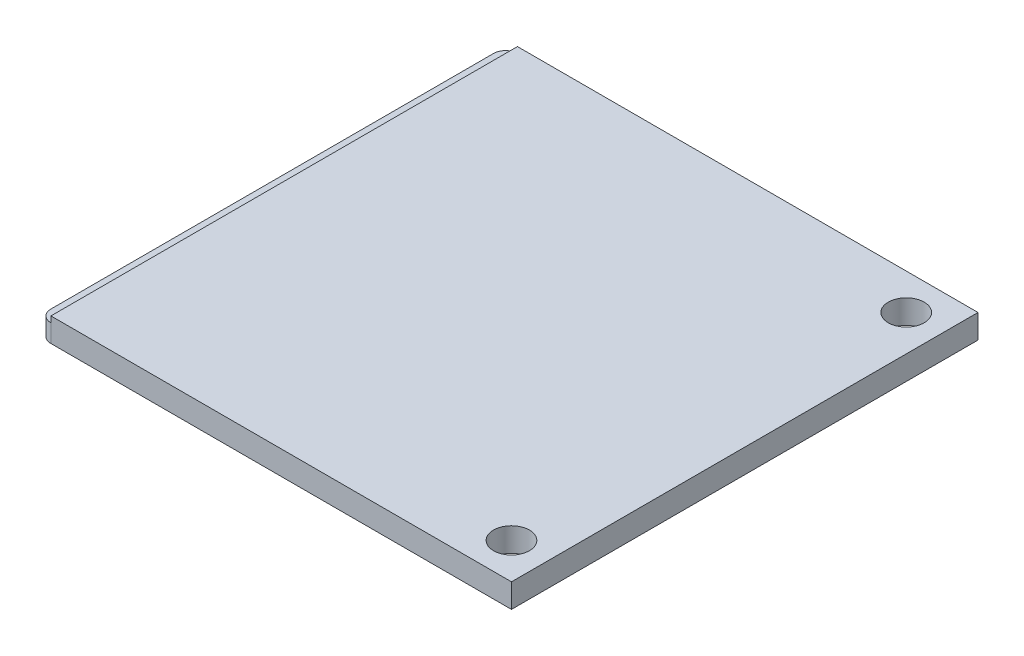
ISO-10303-21;
HEADER;
FILE_DESCRIPTION(('STEP AP214'),'2;1');
FILE_NAME('part.step','',(''),(''),'','','');
FILE_SCHEMA(('AUTOMOTIVE_DESIGN { 1 0 10303 214 1 1 1 1 }'));
ENDSEC;
DATA;
#1=APPLICATION_CONTEXT('core data for automotive mechanical design processes');
#2=APPLICATION_PROTOCOL_DEFINITION('international standard','automotive_design',2000,#1);
#3=PRODUCT_CONTEXT('',#1,'mechanical');
#4=PRODUCT('Part','Part','',(#3));
#5=PRODUCT_RELATED_PRODUCT_CATEGORY('part','',(#4));
#6=PRODUCT_DEFINITION_FORMATION('','',#4);
#7=PRODUCT_DEFINITION_CONTEXT('part definition',#1,'design');
#8=PRODUCT_DEFINITION('design','',#6,#7);
#9=PRODUCT_DEFINITION_SHAPE('','',#8);
#10=(LENGTH_UNIT() NAMED_UNIT(*) SI_UNIT(.MILLI.,.METRE.));
#11=(NAMED_UNIT(*) PLANE_ANGLE_UNIT() SI_UNIT($,.RADIAN.));
#12=(NAMED_UNIT(*) SI_UNIT($,.STERADIAN.) SOLID_ANGLE_UNIT());
#13=UNCERTAINTY_MEASURE_WITH_UNIT(LENGTH_MEASURE(1.E-05),#10,'distance_accuracy_value','');
#14=(GEOMETRIC_REPRESENTATION_CONTEXT(3) GLOBAL_UNCERTAINTY_ASSIGNED_CONTEXT((#13)) GLOBAL_UNIT_ASSIGNED_CONTEXT((#10,
#11,#12)) REPRESENTATION_CONTEXT('',''));
#15=CARTESIAN_POINT('',(0.,0.,0.));
#16=DIRECTION('',(0.,0.,1.));
#17=DIRECTION('',(1.,0.,0.));
#18=AXIS2_PLACEMENT_3D('',#15,#16,#17);
#19=CARTESIAN_POINT('',(0.,2.,0.));
#20=DIRECTION('',(1.,0.,0.));
#21=DIRECTION('',(0.,0.,-1.));
#22=AXIS2_PLACEMENT_3D('',#19,#20,#21);
#23=PLANE('',#22);
#24=DIRECTION('',(0.,0.,1.));
#25=VECTOR('',#24,1.);
#26=CARTESIAN_POINT('',(0.,1.5,0.));
#27=LINE('',#26,#25);
#28=CARTESIAN_POINT('',(0.,1.5,1.));
#29=VERTEX_POINT('',#28);
#30=CARTESIAN_POINT('',(0.,1.5,38.));
#31=VERTEX_POINT('',#30);
#32=EDGE_CURVE('E106',#29,#31,#27,.T.);
#33=ORIENTED_EDGE('',*,*,#32,.F.);
#34=DIRECTION('',(0.,-1.,0.));
#35=VECTOR('',#34,1.);
#36=CARTESIAN_POINT('',(0.,2.,1.));
#37=LINE('',#36,#35);
#38=CARTESIAN_POINT('',(0.,0.,1.));
#39=VERTEX_POINT('',#38);
#40=EDGE_CURVE('E274',#29,#39,#37,.T.);
#41=ORIENTED_EDGE('',*,*,#40,.T.);
#42=DIRECTION('',(0.,0.,1.));
#43=VECTOR('',#42,1.);
#44=CARTESIAN_POINT('',(0.,0.,0.));
#45=LINE('',#44,#43);
#46=CARTESIAN_POINT('',(0.,0.,38.));
#47=VERTEX_POINT('',#46);
#48=EDGE_CURVE('E252',#39,#47,#45,.T.);
#49=ORIENTED_EDGE('',*,*,#48,.T.);
#50=DIRECTION('',(0.,-1.,0.));
#51=VECTOR('',#50,1.);
#52=CARTESIAN_POINT('',(0.,2.,38.));
#53=LINE('',#52,#51);
#54=EDGE_CURVE('E272',#47,#31,#53,.F.);
#55=ORIENTED_EDGE('',*,*,#54,.T.);
#56=EDGE_LOOP('',(#33,#41,#49,#55));
#57=FACE_BOUND('',#56,.T.);
#58=ADVANCED_FACE('F39',(#57),#23,.F.);
#59=CARTESIAN_POINT('',(0.,2.,39.));
#60=DIRECTION('',(0.,0.,-1.));
#61=DIRECTION('',(-1.,0.,0.));
#62=AXIS2_PLACEMENT_3D('',#59,#60,#61);
#63=PLANE('',#62);
#64=DIRECTION('',(0.,1.,0.));
#65=VECTOR('',#64,1.);
#66=CARTESIAN_POINT('',(1.,1.5,39.));
#67=LINE('',#66,#65);
#68=CARTESIAN_POINT('',(1.,1.5,39.));
#69=VERTEX_POINT('',#68);
#70=CARTESIAN_POINT('',(1.,2.,39.));
#71=VERTEX_POINT('',#70);
#72=EDGE_CURVE('E114',#69,#71,#67,.T.);
#73=ORIENTED_EDGE('',*,*,#72,.F.);
#74=DIRECTION('',(0.,-1.,0.));
#75=VECTOR('',#74,1.);
#76=CARTESIAN_POINT('',(1.,2.,39.));
#77=LINE('',#76,#75);
#78=CARTESIAN_POINT('',(1.,0.,39.));
#79=VERTEX_POINT('',#78);
#80=EDGE_CURVE('E11',#69,#79,#77,.T.);
#81=ORIENTED_EDGE('',*,*,#80,.T.);
#82=DIRECTION('',(1.,0.,0.));
#83=VECTOR('',#82,1.);
#84=CARTESIAN_POINT('',(0.,0.,39.));
#85=LINE('',#84,#83);
#86=CARTESIAN_POINT('',(39.5,0.,39.));
#87=VERTEX_POINT('',#86);
#88=EDGE_CURVE('E263',#79,#87,#85,.T.);
#89=ORIENTED_EDGE('',*,*,#88,.T.);
#90=DIRECTION('',(0.,-1.,0.));
#91=VECTOR('',#90,1.);
#92=CARTESIAN_POINT('',(39.5,2.,39.));
#93=LINE('',#92,#91);
#94=CARTESIAN_POINT('',(39.5,2.,39.));
#95=VERTEX_POINT('',#94);
#96=EDGE_CURVE('E269',#95,#87,#93,.T.);
#97=ORIENTED_EDGE('',*,*,#96,.F.);
#98=DIRECTION('',(1.,0.,0.));
#99=VECTOR('',#98,1.);
#100=CARTESIAN_POINT('',(0.,2.,39.));
#101=LINE('',#100,#99);
#102=EDGE_CURVE('E125',#71,#95,#101,.T.);
#103=ORIENTED_EDGE('',*,*,#102,.F.);
#104=EDGE_LOOP('',(#73,#81,#89,#97,#103));
#105=FACE_BOUND('',#104,.T.);
#106=ADVANCED_FACE('F117',(#105),#63,.F.);
#107=CARTESIAN_POINT('',(39.5,2.,0.));
#108=DIRECTION('',(-1.,0.,0.));
#109=DIRECTION('',(0.,0.,1.));
#110=AXIS2_PLACEMENT_3D('',#107,#108,#109);
#111=PLANE('',#110);
#112=DIRECTION('',(0.,0.,-1.));
#113=VECTOR('',#112,1.);
#114=CARTESIAN_POINT('',(39.5,0.,0.));
#115=LINE('',#114,#113);
#116=CARTESIAN_POINT('',(39.5,0.,0.));
#117=VERTEX_POINT('',#116);
#118=EDGE_CURVE('E264',#87,#117,#115,.T.);
#119=ORIENTED_EDGE('',*,*,#118,.T.);
#120=DIRECTION('',(0.,-1.,0.));
#121=VECTOR('',#120,1.);
#122=CARTESIAN_POINT('',(39.5,2.,0.));
#123=LINE('',#122,#121);
#124=CARTESIAN_POINT('',(39.5,2.,0.));
#125=VERTEX_POINT('',#124);
#126=EDGE_CURVE('E257',#125,#117,#123,.T.);
#127=ORIENTED_EDGE('',*,*,#126,.F.);
#128=DIRECTION('',(0.,0.,-1.));
#129=VECTOR('',#128,1.);
#130=CARTESIAN_POINT('',(39.5,2.,0.));
#131=LINE('',#130,#129);
#132=EDGE_CURVE('E255',#95,#125,#131,.T.);
#133=ORIENTED_EDGE('',*,*,#132,.F.);
#134=ORIENTED_EDGE('',*,*,#96,.T.);
#135=EDGE_LOOP('',(#119,#127,#133,#134));
#136=FACE_BOUND('',#135,.T.);
#137=ADVANCED_FACE('F140',(#136),#111,.F.);
#138=CARTESIAN_POINT('',(0.,2.,0.));
#139=DIRECTION('',(0.,0.,1.));
#140=DIRECTION('',(1.,0.,0.));
#141=AXIS2_PLACEMENT_3D('',#138,#139,#140);
#142=PLANE('',#141);
#143=DIRECTION('',(-1.,0.,0.));
#144=VECTOR('',#143,1.);
#145=CARTESIAN_POINT('',(0.,0.,0.));
#146=LINE('',#145,#144);
#147=CARTESIAN_POINT('',(1.,0.,0.));
#148=VERTEX_POINT('',#147);
#149=EDGE_CURVE('E254',#117,#148,#146,.T.);
#150=ORIENTED_EDGE('',*,*,#149,.T.);
#151=DIRECTION('',(0.,-1.,0.));
#152=VECTOR('',#151,1.);
#153=CARTESIAN_POINT('',(1.,2.,0.));
#154=LINE('',#153,#152);
#155=CARTESIAN_POINT('',(1.,1.5,0.));
#156=VERTEX_POINT('',#155);
#157=EDGE_CURVE('E110',#148,#156,#154,.F.);
#158=ORIENTED_EDGE('',*,*,#157,.T.);
#159=DIRECTION('',(0.,1.,0.));
#160=VECTOR('',#159,1.);
#161=CARTESIAN_POINT('',(1.,1.5,0.));
#162=LINE('',#161,#160);
#163=CARTESIAN_POINT('',(1.,2.,0.));
#164=VERTEX_POINT('',#163);
#165=EDGE_CURVE('E119',#156,#164,#162,.T.);
#166=ORIENTED_EDGE('',*,*,#165,.T.);
#167=DIRECTION('',(-1.,0.,0.));
#168=VECTOR('',#167,1.);
#169=CARTESIAN_POINT('',(0.,2.,0.));
#170=LINE('',#169,#168);
#171=EDGE_CURVE('E260',#125,#164,#170,.T.);
#172=ORIENTED_EDGE('',*,*,#171,.F.);
#173=ORIENTED_EDGE('',*,*,#126,.T.);
#174=EDGE_LOOP('',(#150,#158,#166,#172,#173));
#175=FACE_BOUND('',#174,.T.);
#176=ADVANCED_FACE('F141',(#175),#142,.F.);
#177=CARTESIAN_POINT('',(0.,2.,0.));
#178=DIRECTION('',(0.,1.,0.));
#179=DIRECTION('',(0.,0.,1.));
#180=AXIS2_PLACEMENT_3D('',#177,#178,#179);
#181=PLANE('',#180);
#182=DIRECTION('',(0.,0.,-1.));
#183=VECTOR('',#182,1.);
#184=CARTESIAN_POINT('',(1.,2.,0.));
#185=LINE('',#184,#183);
#186=EDGE_CURVE('E281',#71,#164,#185,.T.);
#187=ORIENTED_EDGE('',*,*,#186,.F.);
#188=ORIENTED_EDGE('',*,*,#102,.T.);
#189=ORIENTED_EDGE('',*,*,#132,.T.);
#190=ORIENTED_EDGE('',*,*,#171,.T.);
#191=EDGE_LOOP('',(#187,#188,#189,#190));
#192=FACE_BOUND('',#191,.T.);
#193=CARTESIAN_POINT('',(36.5,2.,3.));
#194=DIRECTION('',(0.,1.,0.));
#195=DIRECTION('',(0.,0.,1.));
#196=AXIS2_PLACEMENT_3D('',#193,#194,#195);
#197=CIRCLE('',#196,1.49999999999999);
#198=CARTESIAN_POINT('',(36.5,2.,4.49999999999999));
#199=VERTEX_POINT('',#198);
#200=EDGE_CURVE('E238',#199,#199,#197,.T.);
#201=ORIENTED_EDGE('',*,*,#200,.F.);
#202=EDGE_LOOP('',(#201));
#203=FACE_BOUND('',#202,.T.);
#204=CARTESIAN_POINT('',(36.5,2.,36.));
#205=DIRECTION('',(0.,1.,0.));
#206=DIRECTION('',(0.,0.,1.));
#207=AXIS2_PLACEMENT_3D('',#204,#205,#206);
#208=CIRCLE('',#207,1.49999999999999);
#209=CARTESIAN_POINT('',(36.5,2.,37.5));
#210=VERTEX_POINT('',#209);
#211=EDGE_CURVE('E245',#210,#210,#208,.T.);
#212=ORIENTED_EDGE('',*,*,#211,.F.);
#213=EDGE_LOOP('',(#212));
#214=FACE_BOUND('',#213,.T.);
#215=ADVANCED_FACE('F150',(#192,#203,#214),#181,.T.);
#216=CARTESIAN_POINT('',(0.,0.,0.));
#217=DIRECTION('',(0.,1.,0.));
#218=DIRECTION('',(0.,0.,1.));
#219=AXIS2_PLACEMENT_3D('',#216,#217,#218);
#220=PLANE('',#219);
#221=CARTESIAN_POINT('',(36.5,0.,3.));
#222=DIRECTION('',(0.,1.,0.));
#223=DIRECTION('',(0.,0.,1.));
#224=AXIS2_PLACEMENT_3D('',#221,#222,#223);
#225=CIRCLE('',#224,1.5);
#226=CARTESIAN_POINT('',(36.5,0.,4.5));
#227=VERTEX_POINT('',#226);
#228=EDGE_CURVE('E240',#227,#227,#225,.T.);
#229=ORIENTED_EDGE('',*,*,#228,.T.);
#230=EDGE_LOOP('',(#229));
#231=FACE_BOUND('',#230,.T.);
#232=CARTESIAN_POINT('',(36.5,0.,36.));
#233=DIRECTION('',(0.,1.,0.));
#234=DIRECTION('',(0.,0.,1.));
#235=AXIS2_PLACEMENT_3D('',#232,#233,#234);
#236=CIRCLE('',#235,1.5);
#237=CARTESIAN_POINT('',(36.5,0.,37.5));
#238=VERTEX_POINT('',#237);
#239=EDGE_CURVE('E248',#238,#238,#236,.T.);
#240=ORIENTED_EDGE('',*,*,#239,.T.);
#241=EDGE_LOOP('',(#240));
#242=FACE_BOUND('',#241,.T.);
#243=ORIENTED_EDGE('',*,*,#48,.F.);
#244=CARTESIAN_POINT('',(1.,0.,1.));
#245=DIRECTION('',(0.,1.,0.));
#246=DIRECTION('',(0.,0.,1.));
#247=AXIS2_PLACEMENT_3D('',#244,#245,#246);
#248=CIRCLE('',#247,1.);
#249=EDGE_CURVE('E64',#39,#148,#248,.F.);
#250=ORIENTED_EDGE('',*,*,#249,.T.);
#251=ORIENTED_EDGE('',*,*,#149,.F.);
#252=ORIENTED_EDGE('',*,*,#118,.F.);
#253=ORIENTED_EDGE('',*,*,#88,.F.);
#254=CARTESIAN_POINT('',(1.,0.,38.));
#255=DIRECTION('',(0.,1.,0.));
#256=DIRECTION('',(0.,0.,1.));
#257=AXIS2_PLACEMENT_3D('',#254,#255,#256);
#258=CIRCLE('',#257,1.);
#259=EDGE_CURVE('E53',#79,#47,#258,.F.);
#260=ORIENTED_EDGE('',*,*,#259,.T.);
#261=EDGE_LOOP('',(#243,#250,#251,#252,#253,#260));
#262=FACE_BOUND('',#261,.T.);
#263=ADVANCED_FACE('F149',(#231,#242,#262),#220,.F.);
#264=CARTESIAN_POINT('',(36.5,2.,36.));
#265=DIRECTION('',(0.,1.,0.));
#266=DIRECTION('',(0.,0.,1.));
#267=AXIS2_PLACEMENT_3D('',#264,#265,#266);
#268=CYLINDRICAL_SURFACE('',#267,1.49999999999999);
#269=ORIENTED_EDGE('',*,*,#239,.F.);
#270=EDGE_LOOP('',(#269));
#271=FACE_BOUND('',#270,.T.);
#272=ORIENTED_EDGE('',*,*,#211,.T.);
#273=EDGE_LOOP('',(#272));
#274=FACE_BOUND('',#273,.T.);
#275=ADVANCED_FACE('F155',(#271,#274),#268,.F.);
#276=CARTESIAN_POINT('',(36.5,2.,3.));
#277=DIRECTION('',(0.,1.,0.));
#278=DIRECTION('',(0.,0.,1.));
#279=AXIS2_PLACEMENT_3D('',#276,#277,#278);
#280=CYLINDRICAL_SURFACE('',#279,1.49999999999999);
#281=ORIENTED_EDGE('',*,*,#228,.F.);
#282=EDGE_LOOP('',(#281));
#283=FACE_BOUND('',#282,.T.);
#284=ORIENTED_EDGE('',*,*,#200,.T.);
#285=EDGE_LOOP('',(#284));
#286=FACE_BOUND('',#285,.T.);
#287=ADVANCED_FACE('F158',(#283,#286),#280,.F.);
#288=CARTESIAN_POINT('',(1.,1.5,0.));
#289=DIRECTION('',(1.,0.,0.));
#290=DIRECTION('',(0.,0.,-1.));
#291=AXIS2_PLACEMENT_3D('',#288,#289,#290);
#292=PLANE('',#291);
#293=ORIENTED_EDGE('',*,*,#186,.T.);
#294=ORIENTED_EDGE('',*,*,#165,.F.);
#295=DIRECTION('',(0.,0.,-1.));
#296=VECTOR('',#295,1.);
#297=CARTESIAN_POINT('',(1.,1.5,0.));
#298=LINE('',#297,#296);
#299=EDGE_CURVE('E103',#69,#156,#298,.T.);
#300=ORIENTED_EDGE('',*,*,#299,.F.);
#301=ORIENTED_EDGE('',*,*,#72,.T.);
#302=EDGE_LOOP('',(#293,#294,#300,#301));
#303=FACE_BOUND('',#302,.T.);
#304=ADVANCED_FACE('F115',(#303),#292,.F.);
#305=CARTESIAN_POINT('',(0.,1.5,0.));
#306=DIRECTION('',(0.,1.,0.));
#307=DIRECTION('',(0.,0.,1.));
#308=AXIS2_PLACEMENT_3D('',#305,#306,#307);
#309=PLANE('',#308);
#310=ORIENTED_EDGE('',*,*,#299,.T.);
#311=CARTESIAN_POINT('',(1.,1.5,1.));
#312=DIRECTION('',(0.,1.,0.));
#313=DIRECTION('',(0.,0.,1.));
#314=AXIS2_PLACEMENT_3D('',#311,#312,#313);
#315=CIRCLE('',#314,1.);
#316=EDGE_CURVE('E50',#156,#29,#315,.T.);
#317=ORIENTED_EDGE('',*,*,#316,.T.);
#318=ORIENTED_EDGE('',*,*,#32,.T.);
#319=CARTESIAN_POINT('',(1.,1.5,38.));
#320=DIRECTION('',(0.,1.,0.));
#321=DIRECTION('',(0.,0.,1.));
#322=AXIS2_PLACEMENT_3D('',#319,#320,#321);
#323=CIRCLE('',#322,1.);
#324=EDGE_CURVE('E99',#31,#69,#323,.T.);
#325=ORIENTED_EDGE('',*,*,#324,.T.);
#326=EDGE_LOOP('',(#310,#317,#318,#325));
#327=FACE_BOUND('',#326,.T.);
#328=ADVANCED_FACE('F105',(#327),#309,.T.);
#329=CARTESIAN_POINT('',(1.,2.,1.));
#330=DIRECTION('',(0.,-1.,0.));
#331=DIRECTION('',(0.,0.,-1.));
#332=AXIS2_PLACEMENT_3D('',#329,#330,#331);
#333=CYLINDRICAL_SURFACE('',#332,1.);
#334=ORIENTED_EDGE('',*,*,#316,.F.);
#335=ORIENTED_EDGE('',*,*,#157,.F.);
#336=ORIENTED_EDGE('',*,*,#249,.F.);
#337=ORIENTED_EDGE('',*,*,#40,.F.);
#338=EDGE_LOOP('',(#334,#335,#336,#337));
#339=FACE_BOUND('',#338,.T.);
#340=ADVANCED_FACE('F127',(#339),#333,.T.);
#341=CARTESIAN_POINT('',(1.,2.,38.));
#342=DIRECTION('',(0.,-1.,0.));
#343=DIRECTION('',(0.,0.,-1.));
#344=AXIS2_PLACEMENT_3D('',#341,#342,#343);
#345=CYLINDRICAL_SURFACE('',#344,1.);
#346=ORIENTED_EDGE('',*,*,#324,.F.);
#347=ORIENTED_EDGE('',*,*,#54,.F.);
#348=ORIENTED_EDGE('',*,*,#259,.F.);
#349=ORIENTED_EDGE('',*,*,#80,.F.);
#350=EDGE_LOOP('',(#346,#347,#348,#349));
#351=FACE_BOUND('',#350,.T.);
#352=ADVANCED_FACE('F41',(#351),#345,.T.);
#353=CLOSED_SHELL('',(#58,#106,#137,#176,#215,#263,#275,#287,#304,#328,#340,#352));
#354=MANIFOLD_SOLID_BREP('B2',#353);
#355=ADVANCED_BREP_SHAPE_REPRESENTATION('',(#18,#354),#14);
#356=SHAPE_DEFINITION_REPRESENTATION(#9,#355);
ENDSEC;
END-ISO-10303-21;
